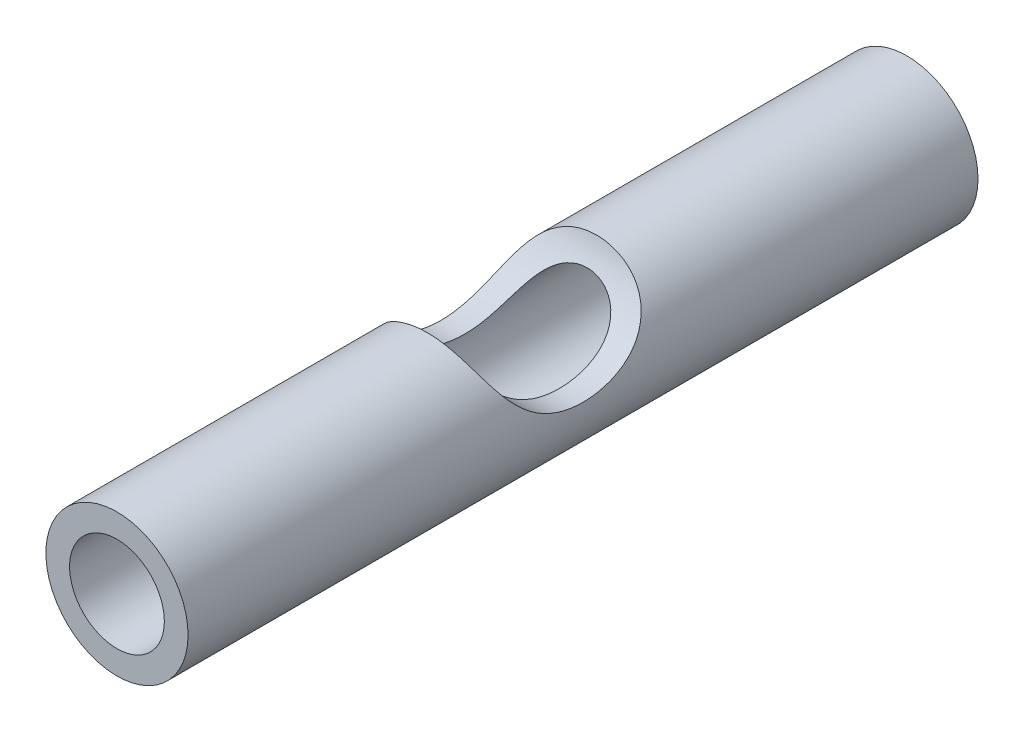
ISO-10303-21;
HEADER;
FILE_DESCRIPTION(('STEP AP214'),'2;1');
FILE_NAME('part.step','',(''),(''),'','','');
FILE_SCHEMA(('AUTOMOTIVE_DESIGN { 1 0 10303 214 1 1 1 1 }'));
ENDSEC;
DATA;
#1=APPLICATION_CONTEXT('core data for automotive mechanical design processes');
#2=APPLICATION_PROTOCOL_DEFINITION('international standard','automotive_design',2000,#1);
#3=PRODUCT_CONTEXT('',#1,'mechanical');
#4=PRODUCT('Part','Part','',(#3));
#5=PRODUCT_RELATED_PRODUCT_CATEGORY('part','',(#4));
#6=PRODUCT_DEFINITION_FORMATION('','',#4);
#7=PRODUCT_DEFINITION_CONTEXT('part definition',#1,'design');
#8=PRODUCT_DEFINITION('design','',#6,#7);
#9=PRODUCT_DEFINITION_SHAPE('','',#8);
#10=(LENGTH_UNIT() NAMED_UNIT(*) SI_UNIT(.MILLI.,.METRE.));
#11=(NAMED_UNIT(*) PLANE_ANGLE_UNIT() SI_UNIT($,.RADIAN.));
#12=(NAMED_UNIT(*) SI_UNIT($,.STERADIAN.) SOLID_ANGLE_UNIT());
#13=UNCERTAINTY_MEASURE_WITH_UNIT(LENGTH_MEASURE(1.E-05),#10,'distance_accuracy_value','');
#14=(GEOMETRIC_REPRESENTATION_CONTEXT(3) GLOBAL_UNCERTAINTY_ASSIGNED_CONTEXT((#13)) GLOBAL_UNIT_ASSIGNED_CONTEXT((#10,
#11,#12)) REPRESENTATION_CONTEXT('',''));
#15=CARTESIAN_POINT('',(0.,0.,0.));
#16=DIRECTION('',(0.,0.,1.));
#17=DIRECTION('',(1.,0.,0.));
#18=AXIS2_PLACEMENT_3D('',#15,#16,#17);
#19=CARTESIAN_POINT('',(0.,0.,-100.));
#20=DIRECTION('',(0.,0.,1.));
#21=DIRECTION('',(1.,0.,0.));
#22=AXIS2_PLACEMENT_3D('',#19,#20,#21);
#23=CYLINDRICAL_SURFACE('',#22,18.);
#24=CARTESIAN_POINT('',(0.,18.,-21.4242852856285));
#25=CARTESIAN_POINT('',(-0.482723448634083,18.0000026337776,-21.4242819498173));
#26=CARTESIAN_POINT('',(-0.965400789787996,17.9805716355008,-21.419777887651));
#27=CARTESIAN_POINT('',(-1.92761515278673,17.9029964527819,-21.4014528911124));
#28=CARTESIAN_POINT('',(-2.40715129330589,17.8448418370865,-21.3876294463));
#29=CARTESIAN_POINT('',(-3.36021549858098,17.6901758312454,-21.3497563507062));
#30=CARTESIAN_POINT('',(-3.83373515272999,17.593615785275,-21.3256937251989));
#31=CARTESIAN_POINT('',(-4.77076903392333,17.3629645352518,-21.2658885626732));
#32=CARTESIAN_POINT('',(-5.23428394790056,17.2288759168248,-21.230146830288));
#33=CARTESIAN_POINT('',(-6.14862574693111,16.9241527531892,-21.1449551791907));
#34=CARTESIAN_POINT('',(-6.59943298805685,16.7534647985943,-21.095485195474));
#35=CARTESIAN_POINT('',(-7.4842217283634,16.3773466890198,-20.9804460127494));
#36=CARTESIAN_POINT('',(-7.91820285229735,16.1719157597686,-20.9148764549364));
#37=CARTESIAN_POINT('',(-8.765608265961,15.7287181945662,-20.764949326512));
#38=CARTESIAN_POINT('',(-9.17904538599662,15.4909720959441,-20.6806036671774));
#39=CARTESIAN_POINT('',(-9.98224247819478,14.9859871912166,-20.4902016086335));
#40=CARTESIAN_POINT('',(-10.3720037736922,14.7187500358384,-20.3841464243056));
#41=CARTESIAN_POINT('',(-11.1105726615361,14.1689500330639,-20.1518785858327));
#42=CARTESIAN_POINT('',(-11.4603658140484,13.8873314050698,-20.0265659690993));
#43=CARTESIAN_POINT('',(-12.1324266018721,13.3042140828534,-19.7508401667208));
#44=CARTESIAN_POINT('',(-12.4546950607702,13.0027159839381,-19.6004277325039));
#45=CARTESIAN_POINT('',(-13.0693967182,12.3846970176139,-19.2727154042335));
#46=CARTESIAN_POINT('',(-13.3618473126158,12.0681850691318,-19.0954313390938));
#47=CARTESIAN_POINT('',(-13.9156464123063,11.4251828482251,-18.7126565832802));
#48=CARTESIAN_POINT('',(-14.1769967282201,11.0986931580907,-18.5071675361845));
#49=CARTESIAN_POINT('',(-14.6498201970884,10.4655255982734,-18.0837253628746));
#50=CARTESIAN_POINT('',(-14.8635510565112,10.1591643268914,-17.8678120296239));
#51=CARTESIAN_POINT('',(-15.2639637215812,9.54699849857829,-17.4115605079872));
#52=CARTESIAN_POINT('',(-15.4506470331271,9.24119391159014,-17.1712236806717));
#53=CARTESIAN_POINT('',(-15.7978304763329,8.63428239979439,-16.6667899621924));
#54=CARTESIAN_POINT('',(-15.9583258361139,8.33317634015612,-16.4026887543364));
#55=CARTESIAN_POINT('',(-16.2545151085417,7.73956077239814,-15.8519068262715));
#56=CARTESIAN_POINT('',(-16.3902079822698,7.44705162481368,-15.565225160939));
#57=CARTESIAN_POINT('',(-16.6416788231571,6.8670851855581,-14.9635510025438));
#58=CARTESIAN_POINT('',(-16.7568944786644,6.57992210961879,-14.6480407874976));
#59=CARTESIAN_POINT('',(-16.9656481627498,6.02127298486974,-13.9966765419533));
#60=CARTESIAN_POINT('',(-17.0591860189589,5.74978706072827,-13.6608223497187));
#61=CARTESIAN_POINT('',(-17.2271919887495,5.22492401234821,-12.9705338985043));
#62=CARTESIAN_POINT('',(-17.3016530823438,4.97155357901692,-12.6160928574525));
#63=CARTESIAN_POINT('',(-17.4341015226696,4.48505004083248,-11.8906446041187));
#64=CARTESIAN_POINT('',(-17.4920877873296,4.25191826595812,-11.5196363055456));
#65=CARTESIAN_POINT('',(-17.6019728726748,3.77354941667545,-10.7051105384367));
#66=CARTESIAN_POINT('',(-17.6515890789372,3.53190229595276,-10.259173506907));
#67=CARTESIAN_POINT('',(-17.7361053847851,3.07953329364946,-9.35054331158046));
#68=CARTESIAN_POINT('',(-17.7710042957995,2.86881391069338,-8.8878487977222));
#69=CARTESIAN_POINT('',(-17.8294763040861,2.47962335675169,-7.94813788164234));
#70=CARTESIAN_POINT('',(-17.8530437425296,2.3011683259722,-7.47111444976956));
#71=CARTESIAN_POINT('',(-17.8917647867716,1.97769404647052,-6.50553304052901));
#72=CARTESIAN_POINT('',(-17.9069179647573,1.8326764980548,-6.01697447798818));
#73=CARTESIAN_POINT('',(-17.9331242736131,1.55727752076299,-4.95526543973035));
#74=CARTESIAN_POINT('',(-17.9431940535203,1.43253907091242,-4.38061890601602));
#75=CARTESIAN_POINT('',(-17.9582520866602,1.2294461005072,-3.22309536597567));
#76=CARTESIAN_POINT('',(-17.9632398817773,1.15109576187579,-2.64021762244809));
#77=CARTESIAN_POINT('',(-17.9699401631626,1.04129377110523,-1.4699241238381));
#78=CARTESIAN_POINT('',(-17.9716520172158,1.00985117182088,-0.882507514769851));
#79=CARTESIAN_POINT('',(-17.9725294986728,0.994098716159139,0.292952987333782));
#80=CARTESIAN_POINT('',(-17.9716951153969,1.00978905746973,0.880996882989834));
#81=CARTESIAN_POINT('',(-17.9670099500997,1.09008854066785,2.08211737968946));
#82=CARTESIAN_POINT('',(-17.9630162570582,1.15701038203653,2.69504020188504));
#83=CARTESIAN_POINT('',(-17.9501393768261,1.34203992152555,3.91308929975023));
#84=CARTESIAN_POINT('',(-17.9412559331634,1.46015030446465,4.51821516475803));
#85=CARTESIAN_POINT('',(-17.915619753841,1.74678997524198,5.71672694279648));
#86=CARTESIAN_POINT('',(-17.8988611972859,1.91535652427805,6.31010383290076));
#87=CARTESIAN_POINT('',(-17.853309890412,2.30154548145856,7.48020878151045));
#88=CARTESIAN_POINT('',(-17.8245174741658,2.51916652772088,8.05693730171715));
#89=CARTESIAN_POINT('',(-17.7498560525614,3.00024924278348,9.18609934635977));
#90=CARTESIAN_POINT('',(-17.7040818733582,3.26345211098949,9.73864908226507));
#91=CARTESIAN_POINT('',(-17.5893743980492,3.83386741244941,10.8181369444079));
#92=CARTESIAN_POINT('',(-17.5204392053763,4.1410834485918,11.3450729691902));
#93=CARTESIAN_POINT('',(-17.3527809788589,4.79527570193276,12.3675087066175));
#94=CARTESIAN_POINT('',(-17.2541141255548,5.14217617164952,12.8630655941442));
#95=CARTESIAN_POINT('',(-17.0785663871523,5.68850773067865,13.579493870175));
#96=CARTESIAN_POINT('',(-17.0154603046604,5.87494560836083,13.8138157025402));
#97=CARTESIAN_POINT('',(-16.8791967950882,6.25568587107619,14.2729405364246));
#98=CARTESIAN_POINT('',(-16.8060402721215,6.44998754759302,14.4977443917814));
#99=CARTESIAN_POINT('',(-16.6126121707201,6.93669455563882,15.0385039665218));
#100=CARTESIAN_POINT('',(-16.486161650521,7.2330571980316,15.3487405680164));
#101=CARTESIAN_POINT('',(-16.2077257493434,7.83710294371991,15.9457478658559));
#102=CARTESIAN_POINT('',(-16.0557448803839,8.14478403919603,16.232522695343));
#103=CARTESIAN_POINT('',(-15.7244555479991,8.76730810957181,16.7810141789156));
#104=CARTESIAN_POINT('',(-15.545165539304,9.08214612670363,17.0427475622664));
#105=CARTESIAN_POINT('',(-15.1579102471983,9.71469236463757,17.5403119314046));
#106=CARTESIAN_POINT('',(-14.9499441329369,10.032400668353,17.7761421663279));
#107=CARTESIAN_POINT('',(-14.50414937023,10.6667871653968,18.2220370251379));
#108=CARTESIAN_POINT('',(-14.2662360473421,10.9834597173009,18.4320251138604));
#109=CARTESIAN_POINT('',(-13.7612503763523,11.6099022453846,18.8255821067969));
#110=CARTESIAN_POINT('',(-13.4941779304832,11.9196721984162,19.0091509224254));
#111=CARTESIAN_POINT('',(-12.9317650895387,12.5276085402944,19.3507277593801));
#112=CARTESIAN_POINT('',(-12.6364161409589,12.8257713794364,19.5087280072083));
#113=CARTESIAN_POINT('',(-12.0191306986569,13.4059653156679,19.8005045715902));
#114=CARTESIAN_POINT('',(-11.6971945275071,13.6879966084049,19.9342811819769));
#115=CARTESIAN_POINT('',(-11.0435115329841,14.220078226795,20.1741021210925));
#116=CARTESIAN_POINT('',(-10.7128142480701,14.4709886817646,20.2811054142577));
#117=CARTESIAN_POINT('',(-10.0311690626858,14.9515733481303,20.4765754612965));
#118=CARTESIAN_POINT('',(-9.68022187797513,15.1812483093771,20.5650428698343));
#119=CARTESIAN_POINT('',(-8.96029357429785,15.6169851413203,20.7254680714281));
#120=CARTESIAN_POINT('',(-8.59130945692313,15.823043066815,20.7974231081155));
#121=CARTESIAN_POINT('',(-7.8377145272388,16.2095523779939,20.9268097787405));
#122=CARTESIAN_POINT('',(-7.45310292610687,16.390002469011,20.9842406784893));
#123=CARTESIAN_POINT('',(-6.64618366806546,16.7341703104585,21.0896609301137));
#124=CARTESIAN_POINT('',(-6.22302237209245,16.8961374997177,21.1368358852572));
#125=CARTESIAN_POINT('',(-5.36462109266054,17.1879719786877,21.2189376654995));
#126=CARTESIAN_POINT('',(-4.9293807157192,17.3178382213248,21.2538640910895));
#127=CARTESIAN_POINT('',(-4.04954862074384,17.5444455246149,21.3131569069865));
#128=CARTESIAN_POINT('',(-3.60495467254014,17.6411785881095,21.337520748242));
#129=CARTESIAN_POINT('',(-2.70931771944663,17.8007452332807,21.3769618941432));
#130=CARTESIAN_POINT('',(-2.25827452107964,17.8635777957445,21.3920389195844));
#131=CARTESIAN_POINT('',(-1.32355333952235,17.9578034239971,21.4144528058216));
#132=CARTESIAN_POINT('',(-0.839632079285049,17.986930345287,21.421233359964));
#133=CARTESIAN_POINT('',(0.129037568011095,18.0060558526158,21.4256997247594));
#134=CARTESIAN_POINT('',(0.613785990621218,17.9960527122343,21.423385134134));
#135=CARTESIAN_POINT('',(1.58088719632875,17.9369879274465,21.4095032736134));
#136=CARTESIAN_POINT('',(2.06323937083153,17.8879168246226,21.3979337630836));
#137=CARTESIAN_POINT('',(3.02208180818051,17.7510998355817,21.3647839269024));
#138=CARTESIAN_POINT('',(3.49857207730103,17.6633539907639,21.3432036119671));
#139=CARTESIAN_POINT('',(4.44967423149317,17.4482599938967,21.288275988445));
#140=CARTESIAN_POINT('',(4.92414164132448,17.3203171331022,21.2547508881704));
#141=CARTESIAN_POINT('',(5.86000719010276,17.0264750603656,21.1740453217249));
#142=CARTESIAN_POINT('',(6.32140505646233,16.8605750574173,21.1268645709722));
#143=CARTESIAN_POINT('',(7.22745032248506,16.4925135241812,21.0164104747894));
#144=CARTESIAN_POINT('',(7.67210025380768,16.2903575012776,20.9531395728861));
#145=CARTESIAN_POINT('',(8.54108487477901,15.8520230575815,20.8076839755613));
#146=CARTESIAN_POINT('',(8.96542048944276,15.6158461878996,20.7255001423341));
#147=CARTESIAN_POINT('',(9.77684372592237,15.1205780755499,20.542203142027));
#148=CARTESIAN_POINT('',(10.1646923889653,14.862475844845,20.4417887064246));
#149=CARTESIAN_POINT('',(10.9149002816104,14.3205804180719,20.217655502329));
#150=CARTESIAN_POINT('',(11.2772601127403,14.0367878286491,20.0939372840508));
#151=CARTESIAN_POINT('',(11.9733686637159,13.4479035765456,19.8207636141065));
#152=CARTESIAN_POINT('',(12.3071401185472,13.1428291952908,19.6713289035839));
#153=CARTESIAN_POINT('',(12.9440147301787,12.5160713816532,19.3445611199789));
#154=CARTESIAN_POINT('',(13.2471203007143,12.1943892594934,19.1672302454366));
#155=CARTESIAN_POINT('',(13.7987686315958,11.5652617092584,18.798118925132));
#156=CARTESIAN_POINT('',(14.0497189615448,11.2586426037579,18.6085205451176));
#157=CARTESIAN_POINT('',(14.5234540305013,10.6405305581283,18.2038434883788));
#158=CARTESIAN_POINT('',(14.7462404386831,10.3290379080675,17.988766323155));
#159=CARTESIAN_POINT('',(15.1637061467602,9.70580911549398,17.5332104082964));
#160=CARTESIAN_POINT('',(15.3583848953468,9.39407296832589,17.2927311605807));
#161=CARTESIAN_POINT('',(15.7203970014209,8.77483772634327,16.7870350957162));
#162=CARTESIAN_POINT('',(15.8877298128078,8.46733871625698,16.5218177847124));
#163=CARTESIAN_POINT('',(16.1940186592959,7.86549454742262,15.9721702591088));
#164=CARTESIAN_POINT('',(16.3333798857641,7.57101852961554,15.6881081592371));
#165=CARTESIAN_POINT('',(16.5888018425752,6.99366307540372,15.098589575434));
#166=CARTESIAN_POINT('',(16.7048629804158,6.71078343625755,14.7931334657908));
#167=CARTESIAN_POINT('',(16.915903690234,6.15949428035006,14.1623755342592));
#168=CARTESIAN_POINT('',(17.0108765393835,5.89108939864748,13.8370674256781));
#169=CARTESIAN_POINT('',(17.1820878138036,5.37128995685315,13.1684451961035));
#170=CARTESIAN_POINT('',(17.2583250258812,5.11989649906968,12.8251299108325));
#171=CARTESIAN_POINT('',(17.4029568140366,4.60617747601213,12.0787867856657));
#172=CARTESIAN_POINT('',(17.4692142307379,4.34634725055013,11.6736262481407));
#173=CARTESIAN_POINT('',(17.584634454375,3.85290225018781,10.8453271401091));
#174=CARTESIAN_POINT('',(17.6337961501879,3.61928917991889,10.4221874030635));
#175=CARTESIAN_POINT('',(17.718313222005,3.17985510189857,9.56012755351733));
#176=CARTESIAN_POINT('',(17.753661475699,2.97404846702994,9.12119942743956));
#177=CARTESIAN_POINT('',(17.8135007321873,2.59164757901182,8.23008478341293));
#178=CARTESIAN_POINT('',(17.8379910970213,2.4150550427325,7.77789748807907));
#179=CARTESIAN_POINT('',(17.8822176111904,2.06461926281527,6.78470299650197));
#180=CARTESIAN_POINT('',(17.9004392618098,1.89633977431377,6.24165724167396));
#181=CARTESIAN_POINT('',(17.9291531456669,1.6022753693765,5.14396023436304));
#182=CARTESIAN_POINT('',(17.9396446457525,1.47649448425676,4.58930788620278));
#183=CARTESIAN_POINT('',(17.9555715341119,1.26821960115811,3.47172433405242));
#184=CARTESIAN_POINT('',(17.9610057186403,1.18573591083972,2.9087911914347));
#185=CARTESIAN_POINT('',(17.9685911621253,1.06461250336859,1.77821063520802));
#186=CARTESIAN_POINT('',(17.9707423675961,1.02597350052863,1.21056314494519));
#187=CARTESIAN_POINT('',(17.9726835905693,0.991486169712781,0.0296394680799763));
#188=CARTESIAN_POINT('',(17.9722764881594,0.999208047351422,-0.583744427295735));
#189=CARTESIAN_POINT('',(17.9684471096334,1.06583124349025,-1.80774621448542));
#190=CARTESIAN_POINT('',(17.9650246367667,1.12473590162441,-2.41836392319455));
#191=CARTESIAN_POINT('',(17.9536723339192,1.29336416351234,-3.63291678486371));
#192=CARTESIAN_POINT('',(17.9457395447589,1.40312112226084,-4.23684728493704));
#193=CARTESIAN_POINT('',(17.9226246900325,1.67266286344384,-5.43329643471044));
#194=CARTESIAN_POINT('',(17.9074427665954,1.83244666501325,-6.02581530791396));
#195=CARTESIAN_POINT('',(17.8657897127576,2.20188586936778,-7.19850949689748));
#196=CARTESIAN_POINT('',(17.8392534935316,2.4118256800715,-7.778593076422));
#197=CARTESIAN_POINT('',(17.7697895431691,2.87930406745725,-8.91834924121602));
#198=CARTESIAN_POINT('',(17.7268603975201,3.13684675070534,-9.47802006054284));
#199=CARTESIAN_POINT('',(17.6186308480772,3.69661860629911,-10.5714827922431));
#200=CARTESIAN_POINT('',(17.5533577958814,3.99879288835123,-11.1053054381619));
#201=CARTESIAN_POINT('',(17.3936701550078,4.6444262806391,-12.1427251487978));
#202=CARTESIAN_POINT('',(17.2992650982659,4.98787186457399,-12.64633203577));
#203=CARTESIAN_POINT('',(17.1013420463698,5.62375379257353,-13.5010218965812));
#204=CARTESIAN_POINT('',(17.0055043826234,5.90853365972,-13.859611534331));
#205=CARTESIAN_POINT('',(16.7898710305571,6.49600585997818,-14.5542061458052));
#206=CARTESIAN_POINT('',(16.6700790337423,6.79869542804423,-14.8902145887788));
#207=CARTESIAN_POINT('',(16.4037976081289,7.41814965195129,-15.5372575944918));
#208=CARTESIAN_POINT('',(16.2573307124548,7.73490225880284,-15.848312918853));
#209=CARTESIAN_POINT('',(15.9352237599049,8.37842876157978,-16.4439000326399));
#210=CARTESIAN_POINT('',(15.7595831957908,8.70520283166633,-16.7284313607625));
#211=CARTESIAN_POINT('',(15.3763508548675,9.36559168335275,-17.2709728426894));
#212=CARTESIAN_POINT('',(15.1685932727254,9.69923369783393,-17.5288330687996));
#213=CARTESIAN_POINT('',(14.720868550709,10.3661611880239,-18.0154527952906));
#214=CARTESIAN_POINT('',(14.480901327986,10.6994466628134,-18.244212220816));
#215=CARTESIAN_POINT('',(13.9687549407868,11.3599517467003,-18.672553556854));
#216=CARTESIAN_POINT('',(13.6965765723582,11.6871715054713,-18.8721361881524));
#217=CARTESIAN_POINT('',(13.1209159401043,12.329949374392,-19.2428611964809));
#218=CARTESIAN_POINT('',(12.8174353567982,12.6455081093519,-19.4140050990117));
#219=CARTESIAN_POINT('',(12.2084113293502,13.2332175625062,-19.7157175437289));
#220=CARTESIAN_POINT('',(11.9053097339844,13.5067634777524,-19.848513840403));
#221=CARTESIAN_POINT('',(11.2761996287164,14.0362505851559,-20.0931895549625));
#222=CARTESIAN_POINT('',(10.9501925252751,14.2921928563189,-20.2050702555811));
#223=CARTESIAN_POINT('',(10.27719022109,14.7835396673758,-20.4098182760253));
#224=CARTESIAN_POINT('',(9.93018600374614,15.018935276595,-20.5026773514235));
#225=CARTESIAN_POINT('',(9.21757516382697,15.4665242454648,-20.6713318506186));
#226=CARTESIAN_POINT('',(8.85196792675409,15.67871683794,-20.7471267102986));
#227=CARTESIAN_POINT('',(8.09097369015421,16.0850512732548,-20.8861503896225));
#228=CARTESIAN_POINT('',(7.69498768659605,16.278260773139,-20.9488245400815));
#229=CARTESIAN_POINT('',(6.88823663645294,16.6357114628176,-21.060173036191));
#230=CARTESIAN_POINT('',(6.47747049968419,16.7999505104538,-21.1088463467471));
#231=CARTESIAN_POINT('',(5.64417745041327,17.0979203831778,-21.1940905615635));
#232=CARTESIAN_POINT('',(5.22166028111174,17.2316756843003,-21.2306711860013));
#233=CARTESIAN_POINT('',(4.36731087709277,17.4677714598199,-21.2934102876052));
#234=CARTESIAN_POINT('',(3.93548048960038,17.5701181037211,-21.3195708118601));
#235=CARTESIAN_POINT('',(2.92482853050779,17.7704600622749,-21.3697448461466));
#236=CARTESIAN_POINT('',(2.34341946186039,17.8564587511864,-21.3903589724633));
#237=CARTESIAN_POINT('',(1.17465104897179,17.971228585376,-21.4176315792761));
#238=CARTESIAN_POINT('',(0.587291401118212,17.9999967956913,-21.424289344046));
#239=CARTESIAN_POINT('',(0.,18.,-21.4242852856285));
#240=B_SPLINE_CURVE_WITH_KNOTS('',3,(#24,#25,#26,#27,#28,#29,#30,#31,#32,#33,#34,#35,#36,#37,
#38,#39,#40,#41,#42,#43,#44,#45,#46,#47,#48,#49,#50,#51,#52,#53,#54,#55,#56,#57,#58,#59,#60,#61,
#62,#63,#64,#65,#66,#67,#68,#69,#70,#71,#72,#73,#74,#75,#76,#77,#78,#79,#80,#81,#82,#83,#84,#85,
#86,#87,#88,#89,#90,#91,#92,#93,#94,#95,#96,#97,#98,#99,#100,#101,#102,#103,#104,#105,#106,#107,
#108,#109,#110,#111,#112,#113,#114,#115,#116,#117,#118,#119,#120,#121,#122,#123,#124,#125,#126,
#127,#128,#129,#130,#131,#132,#133,#134,#135,#136,#137,#138,#139,#140,#141,#142,#143,#144,#145,
#146,#147,#148,#149,#150,#151,#152,#153,#154,#155,#156,#157,#158,#159,#160,#161,#162,#163,#164,
#165,#166,#167,#168,#169,#170,#171,#172,#173,#174,#175,#176,#177,#178,#179,#180,#181,#182,#183,
#184,#185,#186,#187,#188,#189,#190,#191,#192,#193,#194,#195,#196,#197,#198,#199,#200,#201,#202,
#203,#204,#205,#206,#207,#208,#209,#210,#211,#212,#213,#214,#215,#216,#217,#218,#219,#220,#221,
#222,#223,#224,#225,#226,#227,#228,#229,#230,#231,#232,#233,#234,#235,#236,#237,#238,#239),
.UNSPECIFIED.,.T.,.F.,(4,2,2,2,2,2,2,2,2,2,2,2,2,2,2,2,2,2,2,2,2,2,2,2,2,2,2,2,2,2,2,2,2,2,2,2,
2,2,2,2,2,2,2,2,2,2,2,2,2,2,2,2,2,2,2,2,2,2,2,2,2,2,2,2,2,2,2,2,2,2,2,2,2,2,2,2,2,2,2,2,2,2,2,2,
2,2,2,2,2,2,2,2,2,2,2,2,2,2,2,2,2,2,2,2,2,2,2,4),(0.,1.44767852774646,2.89574718469209,
4.34565627284012,5.79546549042233,7.24740499018083,8.69937685169696,10.1504302158166,
11.6014024000912,12.998221777971,14.3949993459332,15.790957307516,17.1868339574818,
18.4796701177012,19.7724342703252,21.0654337235846,22.3584873251933,23.6828769429295,
25.0072770910619,26.3321639025346,27.6571377128377,29.1844895386629,30.711964690048,
32.2402018576029,33.7685167193682,35.5308951232602,37.2934323827131,39.056309755139,
40.8191945215478,42.6667255540227,44.5143535004992,46.3633492758132,48.212293724453,
50.0510653702837,51.8899876228276,53.7254566334849,54.6431655131115,55.5607918918316,
56.9011640120671,58.2412994949493,59.5805333381313,60.9198059919339,62.2629542219791,
63.6061069555801,64.9496672778556,66.293211301635,67.577829787817,68.8624028952323,
70.14719027747,71.4320425921736,72.7971951258773,74.1623921824669,75.5279185167298,
76.8934859030223,78.3463338767583,79.7992459509428,81.2525098845209,82.7057722624579,
84.1816372070173,85.6575329106008,87.1332046113593,88.6088090531778,90.0366557654251,
91.464468769662,92.8911355499642,94.3176899487122,95.6337840260808,96.9498000666825,
98.2658419163547,99.5819100442814,100.877263418725,102.172594136622,103.468337207699,
104.764164160248,106.220307573097,107.676545609157,109.133533504459,110.590606994429,
112.295217032463,113.999988720369,115.705166075373,117.410371210538,119.24849338676,
121.086735507935,122.926185077898,124.765598584443,126.615700906737,128.465962906714,
130.313968017807,132.161369105169,133.56351361454,134.965442211411,136.366192002226,
137.76696615022,139.175229484598,140.583496441347,141.99172860227,143.399885198869,
144.686424943354,145.972885759695,147.259902984611,148.546962750096,149.880646436096,
151.214428697183,152.547136233942,153.879581823337,155.640767353556,157.4020432007),.UNSPECIFIED.);
#241=CARTESIAN_POINT('',(0.,18.,-21.4242852856285));
#242=VERTEX_POINT('',#241);
#243=EDGE_CURVE('E56',#242,#242,#240,.T.);
#244=ORIENTED_EDGE('',*,*,#243,.F.);
#245=EDGE_LOOP('',(#244));
#246=FACE_BOUND('',#245,.T.);
#247=CARTESIAN_POINT('',(0.,0.,-100.));
#248=DIRECTION('',(0.,0.,1.));
#249=DIRECTION('',(1.,0.,0.));
#250=AXIS2_PLACEMENT_3D('',#247,#248,#249);
#251=CIRCLE('',#250,18.);
#252=CARTESIAN_POINT('',(18.,0.,-100.));
#253=VERTEX_POINT('',#252);
#254=EDGE_CURVE('E10',#253,#253,#251,.T.);
#255=ORIENTED_EDGE('',*,*,#254,.T.);
#256=EDGE_LOOP('',(#255));
#257=FACE_BOUND('',#256,.T.);
#258=CARTESIAN_POINT('',(0.,0.,100.));
#259=DIRECTION('',(0.,0.,1.));
#260=DIRECTION('',(1.,0.,0.));
#261=AXIS2_PLACEMENT_3D('',#258,#259,#260);
#262=CIRCLE('',#261,18.);
#263=CARTESIAN_POINT('',(18.,0.,100.));
#264=VERTEX_POINT('',#263);
#265=EDGE_CURVE('E48',#264,#264,#262,.T.);
#266=ORIENTED_EDGE('',*,*,#265,.F.);
#267=EDGE_LOOP('',(#266));
#268=FACE_BOUND('',#267,.T.);
#269=ADVANCED_FACE('F31',(#246,#257,#268),#23,.T.);
#270=CARTESIAN_POINT('',(0.,0.,-100.));
#271=DIRECTION('',(0.,0.,1.));
#272=DIRECTION('',(1.,0.,0.));
#273=AXIS2_PLACEMENT_3D('',#270,#271,#272);
#274=PLANE('',#273);
#275=CARTESIAN_POINT('',(0.,0.,-100.));
#276=DIRECTION('',(0.,0.,1.));
#277=DIRECTION('',(1.,0.,0.));
#278=AXIS2_PLACEMENT_3D('',#275,#276,#277);
#279=CIRCLE('',#278,12.);
#280=CARTESIAN_POINT('',(12.,0.,-100.));
#281=VERTEX_POINT('',#280);
#282=EDGE_CURVE('E44',#281,#281,#279,.T.);
#283=ORIENTED_EDGE('',*,*,#282,.T.);
#284=EDGE_LOOP('',(#283));
#285=FACE_BOUND('',#284,.T.);
#286=ORIENTED_EDGE('',*,*,#254,.F.);
#287=EDGE_LOOP('',(#286));
#288=FACE_BOUND('',#287,.T.);
#289=ADVANCED_FACE('F73',(#285,#288),#274,.F.);
#290=CARTESIAN_POINT('',(0.,0.,-100.));
#291=DIRECTION('',(0.,0.,1.));
#292=DIRECTION('',(1.,0.,0.));
#293=AXIS2_PLACEMENT_3D('',#290,#291,#292);
#294=CYLINDRICAL_SURFACE('',#293,12.);
#295=CARTESIAN_POINT('',(0.,12.,-19.0525588832576));
#296=CARTESIAN_POINT('',(-0.292526910658602,12.0000038215091,-19.0525581300085));
#297=CARTESIAN_POINT('',(-0.585007089431436,11.98929538133,-19.0463897951565));
#298=CARTESIAN_POINT('',(-1.16797554044909,11.9465992517583,-19.0216447532263));
#299=CARTESIAN_POINT('',(-1.45846333553099,11.9146066331745,-19.0030651718303));
#300=CARTESIAN_POINT('',(-2.0355504795688,11.829695158221,-18.9532768177024));
#301=CARTESIAN_POINT('',(-2.32214581190976,11.7767561671139,-18.9220558927812));
#302=CARTESIAN_POINT('',(-2.88909920965548,11.6506407289636,-18.8466823587721));
#303=CARTESIAN_POINT('',(-3.16945765721434,11.5774655255693,-18.8025305443629));
#304=CARTESIAN_POINT('',(-3.72184524285626,11.4118786223581,-18.7009321926462));
#305=CARTESIAN_POINT('',(-3.99387748316162,11.3194741896628,-18.6434906768763));
#306=CARTESIAN_POINT('',(-4.52780702696104,11.1166772875827,-18.5148871510361));
#307=CARTESIAN_POINT('',(-4.78970423918834,11.0062846562593,-18.443725017445));
#308=CARTESIAN_POINT('',(-5.30145837858149,10.7691243418862,-18.2873135032492));
#309=CARTESIAN_POINT('',(-5.55132039683684,10.6423636678212,-18.2020701480474));
#310=CARTESIAN_POINT('',(-6.0375107417781,10.3742724293466,-18.0171447537771));
#311=CARTESIAN_POINT('',(-6.2738391347286,10.2329419362847,-17.9174627854127));
#312=CARTESIAN_POINT('',(-6.73189214606212,9.93760475906254,-17.7033084302246));
#313=CARTESIAN_POINT('',(-6.95359706062526,9.7835815764179,-17.5888166793686));
#314=CARTESIAN_POINT('',(-7.38097538674157,9.46531534657754,-17.3450992787676));
#315=CARTESIAN_POINT('',(-7.58664889584067,9.30107236157695,-17.2158737186849));
#316=CARTESIAN_POINT('',(-7.98123412357678,8.96477057803815,-16.9428225700848));
#317=CARTESIAN_POINT('',(-8.17014492574577,8.792711352939,-16.7989961842167));
#318=CARTESIAN_POINT('',(-8.53082027940325,8.44323252079891,-16.4970857950109));
#319=CARTESIAN_POINT('',(-8.70258422520445,8.26581272469191,-16.3390012884015));
#320=CARTESIAN_POINT('',(-9.03728218097035,7.89888006212098,-16.0006739645321));
#321=CARTESIAN_POINT('',(-9.19931842337613,7.7092120736275,-15.819712095011));
#322=CARTESIAN_POINT('',(-9.50482485772761,7.32923944660758,-15.4434054036866));
#323=CARTESIAN_POINT('',(-9.6482948414571,7.13893480096573,-15.2480604206186));
#324=CARTESIAN_POINT('',(-9.91746952217827,6.76001713351102,-14.8438440237967));
#325=CARTESIAN_POINT('',(-10.0431687919996,6.5714046448819,-14.6349685060995));
#326=CARTESIAN_POINT('',(-10.2778083167233,6.19800761115319,-14.204727023228));
#327=CARTESIAN_POINT('',(-10.386744980306,6.01322389366985,-13.9833583953026));
#328=CARTESIAN_POINT('',(-10.6366317094439,5.56378855922609,-13.4224157415823));
#329=CARTESIAN_POINT('',(-10.7685736668627,5.302404820402,-13.0761731213429));
#330=CARTESIAN_POINT('',(-11.0032643709164,4.79645989798501,-12.3621539791324));
#331=CARTESIAN_POINT('',(-11.1060020019462,4.55190514652723,-11.9943693220013));
#332=CARTESIAN_POINT('',(-11.2869927124453,4.08254839962882,-11.2395700563658));
#333=CARTESIAN_POINT('',(-11.3651938762479,3.85778900102231,-10.8525166549293));
#334=CARTESIAN_POINT('',(-11.5012201260004,3.4310456574588,-10.0626854216891));
#335=CARTESIAN_POINT('',(-11.5590448978658,3.22906206360401,-9.65990734760929));
#336=CARTESIAN_POINT('',(-11.6726724150782,2.79510134223733,-8.72348689398315));
#337=CARTESIAN_POINT('',(-11.7231323172016,2.57115216617918,-8.1854616123362));
#338=CARTESIAN_POINT('',(-11.8046537418124,2.16628207484607,-7.09199456068185));
#339=CARTESIAN_POINT('',(-11.8357100932185,1.9853726376867,-6.53654818930615));
#340=CARTESIAN_POINT('',(-11.884563541247,1.66820351876299,-5.41252657735765));
#341=CARTESIAN_POINT('',(-11.9023610696316,1.53194238314665,-4.84395176492276));
#342=CARTESIAN_POINT('',(-11.9293661133325,1.30509471178035,-3.69763083150155));
#343=CARTESIAN_POINT('',(-11.9385742965477,1.21450462494675,-3.11988542716498));
#344=CARTESIAN_POINT('',(-11.9515904193426,1.07897101450957,-1.9535510652219));
#345=CARTESIAN_POINT('',(-11.9553472656543,1.03446047271397,-1.36491123056849));
#346=CARTESIAN_POINT('',(-11.958872234128,0.992879094135336,-0.18593835316911));
#347=CARTESIAN_POINT('',(-11.9586402749066,0.995809225280743,0.404394723878248));
#348=CARTESIAN_POINT('',(-11.9540822160714,1.04911206228919,1.58333150078335));
#349=CARTESIAN_POINT('',(-11.9497531618442,1.09951900585132,2.17193364507847));
#350=CARTESIAN_POINT('',(-11.9352125092337,1.24748225004147,3.3431094777979));
#351=CARTESIAN_POINT('',(-11.9250008856094,1.34503875297926,3.92568314034419));
#352=CARTESIAN_POINT('',(-11.8946035676406,1.59204769812497,5.106823047028));
#353=CARTESIAN_POINT('',(-11.8739912535934,1.74363059559012,5.70493540463886));
#354=CARTESIAN_POINT('',(-11.8168338849202,2.09626579145494,6.88576208954134));
#355=CARTESIAN_POINT('',(-11.7802855782848,2.29732818333367,7.46847324820163));
#356=CARTESIAN_POINT('',(-11.6837033075451,2.74660139538606,8.61258075636117));
#357=CARTESIAN_POINT('',(-11.6237069946727,2.9947363026039,9.17400970184059));
#358=CARTESIAN_POINT('',(-11.5091748981615,3.39977135710827,9.99622698070466));
#359=CARTESIAN_POINT('',(-11.4669138351297,3.54023816213955,10.2669501334394));
#360=CARTESIAN_POINT('',(-11.3728945366261,3.83154273094104,10.8010514007185));
#361=CARTESIAN_POINT('',(-11.3211375412739,3.98237913888852,11.064430469194));
#362=CARTESIAN_POINT('',(-11.1908654007685,4.3369868814055,11.6550954430396));
#363=CARTESIAN_POINT('',(-11.1089112077883,4.54382103008598,11.9798035251231));
#364=CARTESIAN_POINT('',(-10.9243365370385,4.97121937242049,12.6138485663203));
#365=CARTESIAN_POINT('',(-10.8217224834777,5.19177928333853,12.9231902664423));
#366=CARTESIAN_POINT('',(-10.593019227788,5.64375658716878,13.5241245845161));
#367=CARTESIAN_POINT('',(-10.4669632574313,5.8751582674082,13.815741562398));
#368=CARTESIAN_POINT('',(-10.1885319448978,6.34574669101407,14.3795193549988));
#369=CARTESIAN_POINT('',(-10.0361608173748,6.58493218274895,14.6516832754789));
#370=CARTESIAN_POINT('',(-9.7311960867898,7.02587567074535,15.1299193865001));
#371=CARTESIAN_POINT('',(-9.58305766538658,7.2270722001983,15.3393545882088));
#372=CARTESIAN_POINT('',(-9.26612077843399,7.62918816371257,15.7422715193133));
#373=CARTESIAN_POINT('',(-9.09732442370229,7.83010762396664,15.9357548752853));
#374=CARTESIAN_POINT('',(-8.73855136425598,8.22858269872797,16.3058017683496));
#375=CARTESIAN_POINT('',(-8.54857678674929,8.42613864878327,16.4823670014451));
#376=CARTESIAN_POINT('',(-8.14741641094579,8.81462151856464,16.8178751036387));
#377=CARTESIAN_POINT('',(-7.93623030774823,9.00554834294859,16.9768177193549));
#378=CARTESIAN_POINT('',(-7.49207791634335,9.37833882300934,17.2773836816577));
#379=CARTESIAN_POINT('',(-7.25900707826823,9.56015187094436,17.4189155647944));
#380=CARTESIAN_POINT('',(-6.77311382940181,9.91032790829444,17.6835709122424));
#381=CARTESIAN_POINT('',(-6.52029102333692,10.078690628407,17.8066940080159));
#382=CARTESIAN_POINT('',(-5.9965450962911,10.3988290835691,18.0346647824507));
#383=CARTESIAN_POINT('',(-5.72562213083155,10.5506049611077,18.13951261811));
#384=CARTESIAN_POINT('',(-5.16775555791287,10.8347714099879,18.3313017904636));
#385=CARTESIAN_POINT('',(-4.88081314771275,10.9671634273657,18.4182444630804));
#386=CARTESIAN_POINT('',(-4.31976678132479,11.1992557786734,18.5677068563187));
#387=CARTESIAN_POINT('',(-4.04683075167927,11.3008257954981,18.6317202156342));
#388=CARTESIAN_POINT('',(-3.49166390752171,11.4845005852,18.7457988131761));
#389=CARTESIAN_POINT('',(-3.20943369383774,11.566606613536,18.7958649510575));
#390=CARTESIAN_POINT('',(-2.63778061816923,11.7102077046717,18.8824687777749));
#391=CARTESIAN_POINT('',(-2.3483584828128,11.7717048406475,18.9190078274231));
#392=CARTESIAN_POINT('',(-1.76443326750359,11.8732723007777,18.9789202557398));
#393=CARTESIAN_POINT('',(-1.4699301629765,11.9133425212699,19.0022935707132));
#394=CARTESIAN_POINT('',(-0.883936758009007,11.9709482452587,19.0357847936166));
#395=CARTESIAN_POINT('',(-0.592503511268074,11.9889172393045,19.0461577683463));
#396=CARTESIAN_POINT('',(-0.00892879723240429,12.0035457267688,19.0546074956377));
#397=CARTESIAN_POINT('',(0.283212656575345,12.000205622857,19.0526844805518));
#398=CARTESIAN_POINT('',(0.866121573365735,11.9722583895892,19.0365221050043));
#399=CARTESIAN_POINT('',(1.15688909525305,11.9476521804489,19.022283277466));
#400=CARTESIAN_POINT('',(1.73499888750095,11.877481269234,18.9813388325056));
#401=CARTESIAN_POINT('',(2.02234114523536,11.8319164899265,18.9546331691429));
#402=CARTESIAN_POINT('',(2.5917536228374,11.7203685268102,18.8884651715653));
#403=CARTESIAN_POINT('',(2.87382001146127,11.6543710723749,18.8489939207228));
#404=CARTESIAN_POINT('',(3.43046331057679,11.5028310858199,18.7569442641093));
#405=CARTESIAN_POINT('',(3.70504025306016,11.4172886372027,18.704365914336));
#406=CARTESIAN_POINT('',(4.24472375320843,11.2278267797518,18.5857046958984));
#407=CARTESIAN_POINT('',(4.50983177433847,11.1239102256223,18.5196239247983));
#408=CARTESIAN_POINT('',(5.02879032080345,10.899138803204,18.3735437642327));
#409=CARTESIAN_POINT('',(5.28264088385199,10.7782839916657,18.2935444214004));
#410=CARTESIAN_POINT('',(5.77735085800071,10.5214010453178,18.1192890406753));
#411=CARTESIAN_POINT('',(6.01821348213468,10.3853766890256,18.0250365509653));
#412=CARTESIAN_POINT('',(6.48555638482098,10.1001240154848,17.8220041317394));
#413=CARTESIAN_POINT('',(6.71203678502866,9.9508958099495,17.7132243251303));
#414=CARTESIAN_POINT('',(7.14941353498434,9.64145461121321,17.4810371918352));
#415=CARTESIAN_POINT('',(7.36031125496057,9.481242586244,17.3576311537652));
#416=CARTESIAN_POINT('',(7.76568529344383,9.1521743955915,17.0962530091785));
#417=CARTESIAN_POINT('',(7.96016123217269,8.98331803013992,16.9582805659581));
#418=CARTESIAN_POINT('',(8.33734810100673,8.63460577526135,16.66400057149));
#419=CARTESIAN_POINT('',(8.51958235965908,8.4545746477575,16.5072902631355));
#420=CARTESIAN_POINT('',(8.86600833269922,8.09055261926478,16.1792585343137));
#421=CARTESIAN_POINT('',(9.03020013969552,7.90656173860636,16.00793718885));
#422=CARTESIAN_POINT('',(9.34082039724014,7.53706492217349,15.6513118286027));
#423=CARTESIAN_POINT('',(9.48724489740303,7.35155865921878,15.4660047190234));
#424=CARTESIAN_POINT('',(9.76289388171415,6.98134603610366,15.0822370469313));
#425=CARTESIAN_POINT('',(9.89211492748779,6.79663984296497,14.8837738668133));
#426=CARTESIAN_POINT('',(10.1808846322997,6.35941788874364,14.3956823426403));
#427=CARTESIAN_POINT('',(10.3329186533391,6.10821331426803,14.1004055979196));
#428=CARTESIAN_POINT('',(10.6085220037947,5.61595246926372,13.4888529797941));
#429=CARTESIAN_POINT('',(10.7320823305263,5.37489942803464,13.1725705054983));
#430=CARTESIAN_POINT('',(10.9543101517225,4.90616965001449,12.5209690387441));
#431=CARTESIAN_POINT('',(11.0529307175503,4.67851873998538,12.185615591353));
#432=CARTESIAN_POINT('',(11.2285110887364,4.239852806043,11.498827218459));
#433=CARTESIAN_POINT('',(11.3054700523887,4.02883842880565,11.1473916686696));
#434=CARTESIAN_POINT('',(11.463315432959,3.55978919308659,10.3138360965933));
#435=CARTESIAN_POINT('',(11.5373212467228,3.30881630687293,9.82642394477192));
#436=CARTESIAN_POINT('',(11.6608498371784,2.84300118250897,8.8316132184576));
#437=CARTESIAN_POINT('',(11.710364810695,2.62817047420508,8.32420832948137));
#438=CARTESIAN_POINT('',(11.7913932495606,2.23674145600072,7.2932347891128));
#439=CARTESIAN_POINT('',(11.8228981438226,2.06016137455081,6.76965856642411));
#440=CARTESIAN_POINT('',(11.8732418857279,1.74679905377617,5.7102217092957));
#441=CARTESIAN_POINT('',(11.8920817555465,1.61001360319153,5.17436206984298));
#442=CARTESIAN_POINT('',(11.9215606993105,1.37502211995889,4.08376681622584));
#443=CARTESIAN_POINT('',(11.9320434733237,1.27756748733547,3.52886521885473));
#444=CARTESIAN_POINT('',(11.9473464660187,1.12550057836069,2.41314840586062));
#445=CARTESIAN_POINT('',(11.9521666029756,1.07088892033622,1.85233310500709));
#446=CARTESIAN_POINT('',(11.9579011653708,1.0048421110771,0.728092359153856));
#447=CARTESIAN_POINT('',(11.9588152297253,0.993410951528826,0.164666677665653));
#448=CARTESIAN_POINT('',(11.957101888921,1.01380313107769,-0.961402034128932));
#449=CARTESIAN_POINT('',(11.9544743747365,1.04562780178288,-1.52404503980729));
#450=CARTESIAN_POINT('',(11.9442142645547,1.15726114285741,-2.69682431986961));
#451=CARTESIAN_POINT('',(11.9361433646794,1.241215681843,-3.30656682716625));
#452=CARTESIAN_POINT('',(11.911373330916,1.45988547220333,-4.51681854841429));
#453=CARTESIAN_POINT('',(11.8946727412127,1.59460928723706,-5.11732618685066));
#454=CARTESIAN_POINT('',(11.847523298973,1.91368477005533,-6.30436047007763));
#455=CARTESIAN_POINT('',(11.8170771288927,2.09802675199977,-6.89088981923692));
#456=CARTESIAN_POINT('',(11.7354968823859,2.51459262054313,-8.04513123841432));
#457=CARTESIAN_POINT('',(11.6843701655754,2.74679945900531,-8.61284992493111));
#458=CARTESIAN_POINT('',(11.5705604414282,3.1872870311568,-9.57367809119159));
#459=CARTESIAN_POINT('',(11.5147500699764,3.38503434789221,-9.97245995642322));
#460=CARTESIAN_POINT('',(11.3835871157884,3.80288288343039,-10.7548705802557));
#461=CARTESIAN_POINT('',(11.3082359039049,4.02298253348639,-11.1385003996468));
#462=CARTESIAN_POINT('',(11.1339270043133,4.48285806207306,-11.8873114454424));
#463=CARTESIAN_POINT('',(11.0350107303672,4.72259894307136,-12.252523690039));
#464=CARTESIAN_POINT('',(10.8091236244262,5.21891977264555,-12.9622721164207));
#465=CARTESIAN_POINT('',(10.6821597016925,5.47549556318407,-13.3068133637681));
#466=CARTESIAN_POINT('',(10.4277308185366,5.94277721051094,-13.8982031746211));
#467=CARTESIAN_POINT('',(10.3066396206093,6.15101483809168,-14.1497540455663));
#468=CARTESIAN_POINT('',(10.0430987707257,6.5725124798686,-14.636985364416));
#469=CARTESIAN_POINT('',(9.90065163264906,6.78577190044537,-14.8726676755366));
#470=CARTESIAN_POINT('',(9.59294598703852,7.2142156659864,-15.3266568906546));
#471=CARTESIAN_POINT('',(9.42769433404196,7.42939941443186,-15.5449689847878));
#472=CARTESIAN_POINT('',(9.07332436948427,7.85825269252469,-15.9629932930446));
#473=CARTESIAN_POINT('',(8.88420581611171,8.07192220680719,-16.162705318683));
#474=CARTESIAN_POINT('',(8.48013872445873,8.49550195446464,-16.5439222131814));
#475=CARTESIAN_POINT('',(8.26500226901689,8.70537049932555,-16.7252748239083));
#476=CARTESIAN_POINT('',(7.81037418182808,9.11546763946157,-17.067251521646));
#477=CARTESIAN_POINT('',(7.57088190718994,9.31569598007019,-17.2278750612424));
#478=CARTESIAN_POINT('',(7.06862107142225,9.70232054477966,-17.5280246932662));
#479=CARTESIAN_POINT('',(6.80585291123966,9.8887170070448,-17.667551148997));
#480=CARTESIAN_POINT('',(6.25883723860103,10.2436914753863,-17.9255339816714));
#481=CARTESIAN_POINT('',(5.97459279480635,10.412272018883,-18.0439933607248));
#482=CARTESIAN_POINT('',(5.4243493301489,10.7080001313079,-18.2464974874606));
#483=CARTESIAN_POINT('',(5.16061438483922,10.837690737491,-18.3330019941113));
#484=CARTESIAN_POINT('',(4.62048940845802,11.0787416498224,-18.4906557695021));
#485=CARTESIAN_POINT('',(4.34410022632131,11.1901031833168,-18.5618060664856));
#486=CARTESIAN_POINT('',(3.78106404768577,11.3926713504671,-18.6891476318277));
#487=CARTESIAN_POINT('',(3.49442913771358,11.4839008770677,-18.7453559064295));
#488=CARTESIAN_POINT('',(2.91291834783179,11.6449965931438,-18.8433747065754));
#489=CARTESIAN_POINT('',(2.61804455574211,11.7148681423189,-18.8851888446038));
#490=CARTESIAN_POINT('',(1.94002555360137,11.8484712367262,-18.9644699448247));
#491=CARTESIAN_POINT('',(1.55496043062855,11.9051972000051,-18.9975589657431));
#492=CARTESIAN_POINT('',(0.779902368996258,11.9809581144738,-19.0416033965158));
#493=CARTESIAN_POINT('',(0.38990967192268,11.9999949063033,-19.0525598872648));
#494=CARTESIAN_POINT('',(0.,12.,-19.0525588832576));
#495=B_SPLINE_CURVE_WITH_KNOTS('',3,(#295,#296,#297,#298,#299,#300,#301,#302,#303,#304,#305,
#306,#307,#308,#309,#310,#311,#312,#313,#314,#315,#316,#317,#318,#319,#320,#321,#322,#323,#324,
#325,#326,#327,#328,#329,#330,#331,#332,#333,#334,#335,#336,#337,#338,#339,#340,#341,#342,#343,
#344,#345,#346,#347,#348,#349,#350,#351,#352,#353,#354,#355,#356,#357,#358,#359,#360,#361,#362,
#363,#364,#365,#366,#367,#368,#369,#370,#371,#372,#373,#374,#375,#376,#377,#378,#379,#380,#381,
#382,#383,#384,#385,#386,#387,#388,#389,#390,#391,#392,#393,#394,#395,#396,#397,#398,#399,#400,
#401,#402,#403,#404,#405,#406,#407,#408,#409,#410,#411,#412,#413,#414,#415,#416,#417,#418,#419,
#420,#421,#422,#423,#424,#425,#426,#427,#428,#429,#430,#431,#432,#433,#434,#435,#436,#437,#438,
#439,#440,#441,#442,#443,#444,#445,#446,#447,#448,#449,#450,#451,#452,#453,#454,#455,#456,#457,
#458,#459,#460,#461,#462,#463,#464,#465,#466,#467,#468,#469,#470,#471,#472,#473,#474,#475,#476,
#477,#478,#479,#480,#481,#482,#483,#484,#485,#486,#487,#488,#489,#490,#491,#492,#493,#494),
.UNSPECIFIED.,.T.,.F.,(4,2,2,2,2,2,2,2,2,2,2,2,2,2,2,2,2,2,2,2,2,2,2,2,2,2,2,2,2,2,2,2,2,2,2,2,
2,2,2,2,2,2,2,2,2,2,2,2,2,2,2,2,2,2,2,2,2,2,2,2,2,2,2,2,2,2,2,2,2,2,2,2,2,2,2,2,2,2,2,2,2,2,2,2,
2,2,2,2,2,2,2,2,2,2,2,2,2,2,2,4),(0.,0.877239305686998,1.75468184149791,2.63296987760171,
3.51120394910107,4.38910671867267,5.26701739199244,6.14455337284605,7.02208505665988,
7.90077595008666,8.77946149654568,9.65819505384641,10.536959640133,11.4605639880468,
12.3841786930676,13.3080748631898,14.2321686994973,15.59045923762,16.9492660714079,
18.3109288555627,19.6726126276684,21.4250823559664,23.1780189216273,24.9308984019438,
26.6836415687271,28.4527087105558,30.2218119465722,31.9921919413759,33.7625795326104,
35.612334519572,37.4624671571672,39.3096411019745,40.2330280228489,41.1562944399176,
42.3361050975818,43.5155494567196,44.6933343824026,45.8709308478713,46.8480230164279,
47.8250154294029,48.8019097984261,49.7788182116285,50.7606573128174,51.742516067466,
52.7243663868074,53.7061434227392,54.5995819325248,55.4929627983896,56.3862537665507,
57.2795490563617,58.1550286095538,59.0304916192051,59.9059167481801,60.7813451031442,
61.657386260974,62.5334236761428,63.4093251046208,64.2852235985193,65.160904403838,
66.0365778010225,66.9121741059551,67.7877906548143,68.6877223996744,69.587649525139,
70.4877763753066,71.3880828604292,72.6354881655259,73.8832873301383,75.1334172690079,
76.3835957775388,78.0408472869213,79.6986264836698,81.3571939704635,83.0156275806661,
84.7043948716247,86.3931865350975,88.0821343098228,89.7711340790974,91.6155500786233,
93.4602773298753,95.3046447372999,97.1483563636893,98.4930758451079,99.8377010156391,
101.179980321367,102.521929337841,103.565842006557,104.609631889144,105.653108711981,
106.696596107823,107.748129245065,108.799690145565,109.851232935555,110.902625757862,
111.820556690811,112.738426132503,113.655246385664,114.571836377184,115.741167413655,
116.910441341678),.UNSPECIFIED.);
#496=CARTESIAN_POINT('',(0.,12.,-19.0525588832576));
#497=VERTEX_POINT('',#496);
#498=EDGE_CURVE('E35',#497,#497,#495,.T.);
#499=ORIENTED_EDGE('',*,*,#498,.T.);
#500=EDGE_LOOP('',(#499));
#501=FACE_BOUND('',#500,.T.);
#502=ORIENTED_EDGE('',*,*,#282,.F.);
#503=EDGE_LOOP('',(#502));
#504=FACE_BOUND('',#503,.T.);
#505=CARTESIAN_POINT('',(0.,0.,100.));
#506=DIRECTION('',(0.,0.,1.));
#507=DIRECTION('',(1.,0.,0.));
#508=AXIS2_PLACEMENT_3D('',#505,#506,#507);
#509=CIRCLE('',#508,12.);
#510=CARTESIAN_POINT('',(12.,0.,100.));
#511=VERTEX_POINT('',#510);
#512=EDGE_CURVE('E53',#511,#511,#509,.T.);
#513=ORIENTED_EDGE('',*,*,#512,.T.);
#514=EDGE_LOOP('',(#513));
#515=FACE_BOUND('',#514,.T.);
#516=ADVANCED_FACE('F69',(#501,#504,#515),#294,.F.);
#517=CARTESIAN_POINT('',(0.,0.,100.));
#518=DIRECTION('',(0.,0.,1.));
#519=DIRECTION('',(1.,0.,0.));
#520=AXIS2_PLACEMENT_3D('',#517,#518,#519);
#521=PLANE('',#520);
#522=ORIENTED_EDGE('',*,*,#265,.T.);
#523=EDGE_LOOP('',(#522));
#524=FACE_BOUND('',#523,.T.);
#525=ORIENTED_EDGE('',*,*,#512,.F.);
#526=EDGE_LOOP('',(#525));
#527=FACE_BOUND('',#526,.T.);
#528=ADVANCED_FACE('F65',(#524,#527),#521,.T.);
#529=CARTESIAN_POINT('',(-18.,23.,0.));
#530=DIRECTION('',(1.,0.,0.));
#531=DIRECTION('',(0.,0.,-1.));
#532=AXIS2_PLACEMENT_3D('',#529,#530,#531);
#533=CYLINDRICAL_SURFACE('',#532,22.);
#534=ORIENTED_EDGE('',*,*,#243,.T.);
#535=EDGE_LOOP('',(#534));
#536=FACE_BOUND('',#535,.T.);
#537=ORIENTED_EDGE('',*,*,#498,.F.);
#538=EDGE_LOOP('',(#537));
#539=FACE_BOUND('',#538,.T.);
#540=ADVANCED_FACE('F61',(#536,#539),#533,.F.);
#541=CLOSED_SHELL('',(#269,#289,#516,#528,#540));
#542=MANIFOLD_SOLID_BREP('B2',#541);
#543=ADVANCED_BREP_SHAPE_REPRESENTATION('',(#18,#542),#14);
#544=SHAPE_DEFINITION_REPRESENTATION(#9,#543);
ENDSEC;
END-ISO-10303-21;
